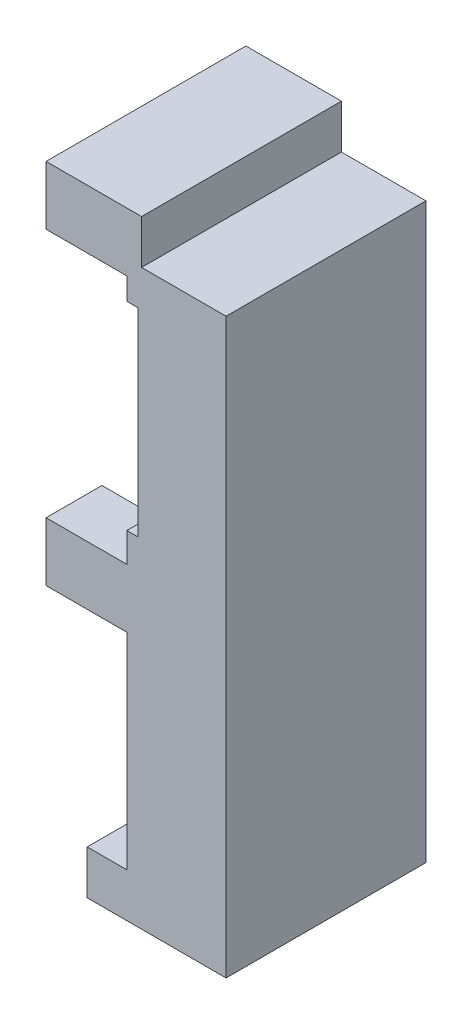
ISO-10303-21;
HEADER;
FILE_DESCRIPTION(('STEP AP214'),'2;1');
FILE_NAME('part.step','',(''),(''),'','','');
FILE_SCHEMA(('AUTOMOTIVE_DESIGN { 1 0 10303 214 1 1 1 1 }'));
ENDSEC;
DATA;
#1=APPLICATION_CONTEXT('core data for automotive mechanical design processes');
#2=APPLICATION_PROTOCOL_DEFINITION('international standard','automotive_design',2000,#1);
#3=PRODUCT_CONTEXT('',#1,'mechanical');
#4=PRODUCT('Part','Part','',(#3));
#5=PRODUCT_RELATED_PRODUCT_CATEGORY('part','',(#4));
#6=PRODUCT_DEFINITION_FORMATION('','',#4);
#7=PRODUCT_DEFINITION_CONTEXT('part definition',#1,'design');
#8=PRODUCT_DEFINITION('design','',#6,#7);
#9=PRODUCT_DEFINITION_SHAPE('','',#8);
#10=(LENGTH_UNIT() NAMED_UNIT(*) SI_UNIT(.MILLI.,.METRE.));
#11=(NAMED_UNIT(*) PLANE_ANGLE_UNIT() SI_UNIT($,.RADIAN.));
#12=(NAMED_UNIT(*) SI_UNIT($,.STERADIAN.) SOLID_ANGLE_UNIT());
#13=UNCERTAINTY_MEASURE_WITH_UNIT(LENGTH_MEASURE(1.E-05),#10,'distance_accuracy_value','');
#14=(GEOMETRIC_REPRESENTATION_CONTEXT(3) GLOBAL_UNCERTAINTY_ASSIGNED_CONTEXT((#13)) GLOBAL_UNIT_ASSIGNED_CONTEXT((#10,
#11,#12)) REPRESENTATION_CONTEXT('',''));
#15=CARTESIAN_POINT('',(0.,0.,0.));
#16=DIRECTION('',(0.,0.,1.));
#17=DIRECTION('',(1.,0.,0.));
#18=AXIS2_PLACEMENT_3D('',#15,#16,#17);
#19=CARTESIAN_POINT('',(10.2,32.,13.6));
#20=DIRECTION('',(1.,0.,0.));
#21=DIRECTION('',(0.,0.,-1.));
#22=AXIS2_PLACEMENT_3D('',#19,#20,#21);
#23=PLANE('',#22);
#24=DIRECTION('',(0.,-1.,0.));
#25=VECTOR('',#24,1.);
#26=CARTESIAN_POINT('',(10.2,32.,3.8));
#27=LINE('',#26,#25);
#28=CARTESIAN_POINT('',(10.2,18.,3.8));
#29=VERTEX_POINT('',#28);
#30=CARTESIAN_POINT('',(10.2,15.,3.8));
#31=VERTEX_POINT('',#30);
#32=EDGE_CURVE('E46',#29,#31,#27,.T.);
#33=ORIENTED_EDGE('',*,*,#32,.T.);
#34=DIRECTION('',(0.,0.,1.));
#35=VECTOR('',#34,1.);
#36=CARTESIAN_POINT('',(10.2,15.,13.6));
#37=LINE('',#36,#35);
#38=CARTESIAN_POINT('',(10.2,15.,9.8));
#39=VERTEX_POINT('',#38);
#40=EDGE_CURVE('E287',#31,#39,#37,.T.);
#41=ORIENTED_EDGE('',*,*,#40,.T.);
#42=DIRECTION('',(0.,-1.,0.));
#43=VECTOR('',#42,1.);
#44=CARTESIAN_POINT('',(10.2,32.,9.8));
#45=LINE('',#44,#43);
#46=CARTESIAN_POINT('',(10.2,18.,9.8));
#47=VERTEX_POINT('',#46);
#48=EDGE_CURVE('E11',#47,#39,#45,.T.);
#49=ORIENTED_EDGE('',*,*,#48,.F.);
#50=DIRECTION('',(0.,0.,-1.));
#51=VECTOR('',#50,1.);
#52=CARTESIAN_POINT('',(10.2,18.,13.6));
#53=LINE('',#52,#51);
#54=CARTESIAN_POINT('',(10.2,18.,13.6));
#55=VERTEX_POINT('',#54);
#56=EDGE_CURVE('E55',#55,#47,#53,.T.);
#57=ORIENTED_EDGE('',*,*,#56,.F.);
#58=DIRECTION('',(0.,-1.,0.));
#59=VECTOR('',#58,1.);
#60=CARTESIAN_POINT('',(10.2,32.,13.6));
#61=LINE('',#60,#59);
#62=CARTESIAN_POINT('',(10.2,32.,13.6));
#63=VERTEX_POINT('',#62);
#64=EDGE_CURVE('E294',#63,#55,#61,.T.);
#65=ORIENTED_EDGE('',*,*,#64,.F.);
#66=DIRECTION('',(0.,0.,-1.));
#67=VECTOR('',#66,1.);
#68=CARTESIAN_POINT('',(10.2,32.,13.6));
#69=LINE('',#68,#67);
#70=CARTESIAN_POINT('',(10.2,32.,9.8));
#71=VERTEX_POINT('',#70);
#72=EDGE_CURVE('E364',#63,#71,#69,.T.);
#73=ORIENTED_EDGE('',*,*,#72,.T.);
#74=DIRECTION('',(0.,-1.,0.));
#75=VECTOR('',#74,1.);
#76=CARTESIAN_POINT('',(10.2,32.,9.8));
#77=LINE('',#76,#75);
#78=CARTESIAN_POINT('',(10.2,31.,9.8));
#79=VERTEX_POINT('',#78);
#80=EDGE_CURVE('E485',#71,#79,#77,.T.);
#81=ORIENTED_EDGE('',*,*,#80,.T.);
#82=DIRECTION('',(0.,0.,-1.));
#83=VECTOR('',#82,1.);
#84=CARTESIAN_POINT('',(10.2,31.,13.6));
#85=LINE('',#84,#83);
#86=CARTESIAN_POINT('',(10.2,31.,3.8));
#87=VERTEX_POINT('',#86);
#88=EDGE_CURVE('E422',#79,#87,#85,.T.);
#89=ORIENTED_EDGE('',*,*,#88,.T.);
#90=DIRECTION('',(0.,-1.,0.));
#91=VECTOR('',#90,1.);
#92=CARTESIAN_POINT('',(10.2,32.,3.8));
#93=LINE('',#92,#91);
#94=CARTESIAN_POINT('',(10.2,32.,3.8));
#95=VERTEX_POINT('',#94);
#96=EDGE_CURVE('E495',#95,#87,#93,.T.);
#97=ORIENTED_EDGE('',*,*,#96,.F.);
#98=CARTESIAN_POINT('',(10.2,32.,0.));
#99=VERTEX_POINT('',#98);
#100=EDGE_CURVE('E325',#95,#99,#69,.T.);
#101=ORIENTED_EDGE('',*,*,#100,.T.);
#102=DIRECTION('',(0.,-1.,0.));
#103=VECTOR('',#102,1.);
#104=CARTESIAN_POINT('',(10.2,32.,0.));
#105=LINE('',#104,#103);
#106=CARTESIAN_POINT('',(10.2,18.,0.));
#107=VERTEX_POINT('',#106);
#108=EDGE_CURVE('E326',#99,#107,#105,.T.);
#109=ORIENTED_EDGE('',*,*,#108,.T.);
#110=DIRECTION('',(0.,0.,-1.));
#111=VECTOR('',#110,1.);
#112=CARTESIAN_POINT('',(10.2,18.,13.6));
#113=LINE('',#112,#111);
#114=EDGE_CURVE('E431',#29,#107,#113,.T.);
#115=ORIENTED_EDGE('',*,*,#114,.F.);
#116=EDGE_LOOP('',(#33,#41,#49,#57,#65,#73,#81,#89,#97,#101,#109,#115));
#117=FACE_BOUND('',#116,.T.);
#118=ADVANCED_FACE('F39',(#117),#23,.F.);
#119=CARTESIAN_POINT('',(10.2,38.,13.6));
#120=DIRECTION('',(1.,0.,0.));
#121=DIRECTION('',(0.,0.,-1.));
#122=AXIS2_PLACEMENT_3D('',#119,#120,#121);
#123=PLANE('',#122);
#124=DIRECTION('',(0.,-1.,0.));
#125=VECTOR('',#124,1.);
#126=CARTESIAN_POINT('',(10.2,38.,3.8));
#127=LINE('',#126,#125);
#128=CARTESIAN_POINT('',(10.2,36.2,3.8));
#129=VERTEX_POINT('',#128);
#130=CARTESIAN_POINT('',(10.2,36.,3.8));
#131=VERTEX_POINT('',#130);
#132=EDGE_CURVE('E497',#129,#131,#127,.T.);
#133=ORIENTED_EDGE('',*,*,#132,.F.);
#134=DIRECTION('',(0.,0.,1.));
#135=VECTOR('',#134,1.);
#136=CARTESIAN_POINT('',(10.2,36.2,13.6));
#137=LINE('',#136,#135);
#138=CARTESIAN_POINT('',(10.2,36.2,9.8));
#139=VERTEX_POINT('',#138);
#140=EDGE_CURVE('E425',#129,#139,#137,.T.);
#141=ORIENTED_EDGE('',*,*,#140,.T.);
#142=DIRECTION('',(0.,-1.,0.));
#143=VECTOR('',#142,1.);
#144=CARTESIAN_POINT('',(10.2,38.,9.8));
#145=LINE('',#144,#143);
#146=CARTESIAN_POINT('',(10.2,36.,9.8));
#147=VERTEX_POINT('',#146);
#148=EDGE_CURVE('E488',#139,#147,#145,.T.);
#149=ORIENTED_EDGE('',*,*,#148,.T.);
#150=DIRECTION('',(0.,0.,-1.));
#151=VECTOR('',#150,1.);
#152=CARTESIAN_POINT('',(10.2,36.,13.6));
#153=LINE('',#152,#151);
#154=CARTESIAN_POINT('',(10.2,36.,13.6));
#155=VERTEX_POINT('',#154);
#156=EDGE_CURVE('E376',#155,#147,#153,.T.);
#157=ORIENTED_EDGE('',*,*,#156,.F.);
#158=DIRECTION('',(0.,-1.,0.));
#159=VECTOR('',#158,1.);
#160=CARTESIAN_POINT('',(10.2,38.,13.6));
#161=LINE('',#160,#159);
#162=CARTESIAN_POINT('',(10.2,38.,13.6));
#163=VERTEX_POINT('',#162);
#164=EDGE_CURVE('E317',#163,#155,#161,.T.);
#165=ORIENTED_EDGE('',*,*,#164,.F.);
#166=DIRECTION('',(0.,0.,-1.));
#167=VECTOR('',#166,1.);
#168=CARTESIAN_POINT('',(10.2,38.,13.6));
#169=LINE('',#168,#167);
#170=CARTESIAN_POINT('',(10.2,38.,9.6));
#171=VERTEX_POINT('',#170);
#172=EDGE_CURVE('E380',#163,#171,#169,.T.);
#173=ORIENTED_EDGE('',*,*,#172,.T.);
#174=DIRECTION('',(0.,-1.,0.));
#175=VECTOR('',#174,1.);
#176=CARTESIAN_POINT('',(10.2,38.,9.6));
#177=LINE('',#176,#175);
#178=CARTESIAN_POINT('',(10.2,37.5,9.6));
#179=VERTEX_POINT('',#178);
#180=EDGE_CURVE('E409',#171,#179,#177,.T.);
#181=ORIENTED_EDGE('',*,*,#180,.T.);
#182=DIRECTION('',(0.,0.,-1.));
#183=VECTOR('',#182,1.);
#184=CARTESIAN_POINT('',(10.2,37.5,13.6));
#185=LINE('',#184,#183);
#186=CARTESIAN_POINT('',(10.2,37.5,4.));
#187=VERTEX_POINT('',#186);
#188=EDGE_CURVE('E412',#179,#187,#185,.T.);
#189=ORIENTED_EDGE('',*,*,#188,.T.);
#190=DIRECTION('',(0.,-1.,0.));
#191=VECTOR('',#190,1.);
#192=CARTESIAN_POINT('',(10.2,38.,4.));
#193=LINE('',#192,#191);
#194=CARTESIAN_POINT('',(10.2,38.,4.));
#195=VERTEX_POINT('',#194);
#196=EDGE_CURVE('E415',#195,#187,#193,.T.);
#197=ORIENTED_EDGE('',*,*,#196,.F.);
#198=CARTESIAN_POINT('',(10.2,38.,0.));
#199=VERTEX_POINT('',#198);
#200=EDGE_CURVE('E379',#195,#199,#169,.T.);
#201=ORIENTED_EDGE('',*,*,#200,.T.);
#202=DIRECTION('',(0.,-1.,0.));
#203=VECTOR('',#202,1.);
#204=CARTESIAN_POINT('',(10.2,38.,0.));
#205=LINE('',#204,#203);
#206=CARTESIAN_POINT('',(10.2,36.,0.));
#207=VERTEX_POINT('',#206);
#208=EDGE_CURVE('E353',#199,#207,#205,.T.);
#209=ORIENTED_EDGE('',*,*,#208,.T.);
#210=EDGE_CURVE('E375',#131,#207,#153,.T.);
#211=ORIENTED_EDGE('',*,*,#210,.F.);
#212=EDGE_LOOP('',(#133,#141,#149,#157,#165,#173,#181,#189,#197,#201,#209,#211));
#213=FACE_BOUND('',#212,.T.);
#214=ADVANCED_FACE('F550',(#213),#123,.F.);
#215=CARTESIAN_POINT('',(10.2,36.,13.6));
#216=DIRECTION('',(0.,-1.,0.));
#217=DIRECTION('',(0.,0.,-1.));
#218=AXIS2_PLACEMENT_3D('',#215,#216,#217);
#219=PLANE('',#218);
#220=DIRECTION('',(-1.,0.,0.));
#221=VECTOR('',#220,1.);
#222=CARTESIAN_POINT('',(10.2,36.,3.8));
#223=LINE('',#222,#221);
#224=CARTESIAN_POINT('',(4.7,36.,3.8));
#225=VERTEX_POINT('',#224);
#226=EDGE_CURVE('E493',#131,#225,#223,.T.);
#227=ORIENTED_EDGE('',*,*,#226,.F.);
#228=ORIENTED_EDGE('',*,*,#210,.T.);
#229=DIRECTION('',(-1.,0.,0.));
#230=VECTOR('',#229,1.);
#231=CARTESIAN_POINT('',(10.2,36.,0.));
#232=LINE('',#231,#230);
#233=CARTESIAN_POINT('',(4.7,36.,0.));
#234=VERTEX_POINT('',#233);
#235=EDGE_CURVE('E356',#207,#234,#232,.T.);
#236=ORIENTED_EDGE('',*,*,#235,.T.);
#237=DIRECTION('',(0.,0.,-1.));
#238=VECTOR('',#237,1.);
#239=CARTESIAN_POINT('',(4.7,36.,13.6));
#240=LINE('',#239,#238);
#241=EDGE_CURVE('E371',#225,#234,#240,.T.);
#242=ORIENTED_EDGE('',*,*,#241,.F.);
#243=EDGE_LOOP('',(#227,#228,#236,#242));
#244=FACE_BOUND('',#243,.T.);
#245=ADVANCED_FACE('F613',(#244),#219,.F.);
#246=CARTESIAN_POINT('',(4.7,36.,13.6));
#247=DIRECTION('',(1.,0.,0.));
#248=DIRECTION('',(0.,0.,-1.));
#249=AXIS2_PLACEMENT_3D('',#246,#247,#248);
#250=PLANE('',#249);
#251=DIRECTION('',(0.,-1.,0.));
#252=VECTOR('',#251,1.);
#253=CARTESIAN_POINT('',(4.7,36.,3.8));
#254=LINE('',#253,#252);
#255=CARTESIAN_POINT('',(4.7,32.,3.8));
#256=VERTEX_POINT('',#255);
#257=EDGE_CURVE('E491',#225,#256,#254,.T.);
#258=ORIENTED_EDGE('',*,*,#257,.F.);
#259=ORIENTED_EDGE('',*,*,#241,.T.);
#260=DIRECTION('',(0.,-1.,0.));
#261=VECTOR('',#260,1.);
#262=CARTESIAN_POINT('',(4.7,36.,0.));
#263=LINE('',#262,#261);
#264=CARTESIAN_POINT('',(4.7,32.,0.));
#265=VERTEX_POINT('',#264);
#266=EDGE_CURVE('E359',#234,#265,#263,.T.);
#267=ORIENTED_EDGE('',*,*,#266,.T.);
#268=DIRECTION('',(0.,0.,-1.));
#269=VECTOR('',#268,1.);
#270=CARTESIAN_POINT('',(4.7,32.,13.6));
#271=LINE('',#270,#269);
#272=EDGE_CURVE('E367',#256,#265,#271,.T.);
#273=ORIENTED_EDGE('',*,*,#272,.F.);
#274=EDGE_LOOP('',(#258,#259,#267,#273));
#275=FACE_BOUND('',#274,.T.);
#276=ADVANCED_FACE('F609',(#275),#250,.F.);
#277=CARTESIAN_POINT('',(4.7,32.,13.6));
#278=DIRECTION('',(0.,1.,0.));
#279=DIRECTION('',(0.,0.,1.));
#280=AXIS2_PLACEMENT_3D('',#277,#278,#279);
#281=PLANE('',#280);
#282=DIRECTION('',(1.,0.,0.));
#283=VECTOR('',#282,1.);
#284=CARTESIAN_POINT('',(4.7,32.,3.8));
#285=LINE('',#284,#283);
#286=EDGE_CURVE('E420',#256,#95,#285,.T.);
#287=ORIENTED_EDGE('',*,*,#286,.F.);
#288=ORIENTED_EDGE('',*,*,#272,.T.);
#289=DIRECTION('',(1.,0.,0.));
#290=VECTOR('',#289,1.);
#291=CARTESIAN_POINT('',(4.7,32.,0.));
#292=LINE('',#291,#290);
#293=EDGE_CURVE('E298',#265,#99,#292,.T.);
#294=ORIENTED_EDGE('',*,*,#293,.T.);
#295=ORIENTED_EDGE('',*,*,#100,.F.);
#296=EDGE_LOOP('',(#287,#288,#294,#295));
#297=FACE_BOUND('',#296,.T.);
#298=ADVANCED_FACE('F605',(#297),#281,.F.);
#299=CARTESIAN_POINT('',(10.95,51.5,13.6));
#300=DIRECTION('',(1.,0.,0.));
#301=DIRECTION('',(0.,0.,-1.));
#302=AXIS2_PLACEMENT_3D('',#299,#300,#301);
#303=PLANE('',#302);
#304=DIRECTION('',(0.,-1.,0.));
#305=VECTOR('',#304,1.);
#306=CARTESIAN_POINT('',(10.95,51.5,4.));
#307=LINE('',#306,#305);
#308=CARTESIAN_POINT('',(10.95,51.5,4.));
#309=VERTEX_POINT('',#308);
#310=CARTESIAN_POINT('',(10.95,38.,4.));
#311=VERTEX_POINT('',#310);
#312=EDGE_CURVE('E329',#309,#311,#307,.T.);
#313=ORIENTED_EDGE('',*,*,#312,.F.);
#314=DIRECTION('',(0.,0.,-1.));
#315=VECTOR('',#314,1.);
#316=CARTESIAN_POINT('',(10.95,51.5,13.6));
#317=LINE('',#316,#315);
#318=CARTESIAN_POINT('',(10.95,51.5,0.));
#319=VERTEX_POINT('',#318);
#320=EDGE_CURVE('E387',#309,#319,#317,.T.);
#321=ORIENTED_EDGE('',*,*,#320,.T.);
#322=DIRECTION('',(0.,-1.,0.));
#323=VECTOR('',#322,1.);
#324=CARTESIAN_POINT('',(10.95,51.5,0.));
#325=LINE('',#324,#323);
#326=CARTESIAN_POINT('',(10.95,38.,0.));
#327=VERTEX_POINT('',#326);
#328=EDGE_CURVE('E347',#319,#327,#325,.T.);
#329=ORIENTED_EDGE('',*,*,#328,.T.);
#330=DIRECTION('',(0.,0.,-1.));
#331=VECTOR('',#330,1.);
#332=CARTESIAN_POINT('',(10.95,38.,13.6));
#333=LINE('',#332,#331);
#334=EDGE_CURVE('E383',#311,#327,#333,.T.);
#335=ORIENTED_EDGE('',*,*,#334,.F.);
#336=EDGE_LOOP('',(#313,#321,#329,#335));
#337=FACE_BOUND('',#336,.T.);
#338=ADVANCED_FACE('F538',(#337),#303,.F.);
#339=CARTESIAN_POINT('',(10.95,38.,13.6));
#340=DIRECTION('',(0.,-1.,0.));
#341=DIRECTION('',(0.,0.,-1.));
#342=AXIS2_PLACEMENT_3D('',#339,#340,#341);
#343=PLANE('',#342);
#344=DIRECTION('',(-1.,0.,0.));
#345=VECTOR('',#344,1.);
#346=CARTESIAN_POINT('',(10.95,38.,4.));
#347=LINE('',#346,#345);
#348=EDGE_CURVE('E525',#311,#195,#347,.T.);
#349=ORIENTED_EDGE('',*,*,#348,.F.);
#350=ORIENTED_EDGE('',*,*,#334,.T.);
#351=DIRECTION('',(-1.,0.,0.));
#352=VECTOR('',#351,1.);
#353=CARTESIAN_POINT('',(10.95,38.,0.));
#354=LINE('',#353,#352);
#355=EDGE_CURVE('E350',#327,#199,#354,.T.);
#356=ORIENTED_EDGE('',*,*,#355,.T.);
#357=ORIENTED_EDGE('',*,*,#200,.F.);
#358=EDGE_LOOP('',(#349,#350,#356,#357));
#359=FACE_BOUND('',#358,.T.);
#360=ADVANCED_FACE('F537',(#359),#343,.F.);
#361=CARTESIAN_POINT('',(16.95,0.,13.6));
#362=DIRECTION('',(-1.,0.,0.));
#363=DIRECTION('',(0.,0.,1.));
#364=AXIS2_PLACEMENT_3D('',#361,#362,#363);
#365=PLANE('',#364);
#366=DIRECTION('',(0.,1.,0.));
#367=VECTOR('',#366,1.);
#368=CARTESIAN_POINT('',(16.95,0.,13.6));
#369=LINE('',#368,#367);
#370=CARTESIAN_POINT('',(16.95,15.,13.6));
#371=VERTEX_POINT('',#370);
#372=CARTESIAN_POINT('',(16.95,54.,13.6));
#373=VERTEX_POINT('',#372);
#374=EDGE_CURVE('E271',#371,#373,#369,.T.);
#375=ORIENTED_EDGE('',*,*,#374,.F.);
#376=DIRECTION('',(0.,0.,-1.));
#377=VECTOR('',#376,1.);
#378=CARTESIAN_POINT('',(16.95,15.,13.6));
#379=LINE('',#378,#377);
#380=CARTESIAN_POINT('',(16.95,15.,0.));
#381=VERTEX_POINT('',#380);
#382=EDGE_CURVE('E281',#371,#381,#379,.T.);
#383=ORIENTED_EDGE('',*,*,#382,.T.);
#384=DIRECTION('',(0.,1.,0.));
#385=VECTOR('',#384,1.);
#386=CARTESIAN_POINT('',(16.95,0.,0.));
#387=LINE('',#386,#385);
#388=CARTESIAN_POINT('',(16.95,54.,0.));
#389=VERTEX_POINT('',#388);
#390=EDGE_CURVE('E328',#381,#389,#387,.T.);
#391=ORIENTED_EDGE('',*,*,#390,.T.);
#392=DIRECTION('',(0.,0.,-1.));
#393=VECTOR('',#392,1.);
#394=CARTESIAN_POINT('',(16.95,54.,13.6));
#395=LINE('',#394,#393);
#396=EDGE_CURVE('E291',#373,#389,#395,.T.);
#397=ORIENTED_EDGE('',*,*,#396,.F.);
#398=EDGE_LOOP('',(#375,#383,#391,#397));
#399=FACE_BOUND('',#398,.T.);
#400=ADVANCED_FACE('F289',(#399),#365,.F.);
#401=CARTESIAN_POINT('',(16.95,54.,13.6));
#402=DIRECTION('',(0.,-1.,0.));
#403=DIRECTION('',(0.,0.,-1.));
#404=AXIS2_PLACEMENT_3D('',#401,#402,#403);
#405=PLANE('',#404);
#406=DIRECTION('',(-1.,0.,0.));
#407=VECTOR('',#406,1.);
#408=CARTESIAN_POINT('',(16.95,54.,0.));
#409=LINE('',#408,#407);
#410=CARTESIAN_POINT('',(11.2,54.,0.));
#411=VERTEX_POINT('',#410);
#412=EDGE_CURVE('E331',#389,#411,#409,.T.);
#413=ORIENTED_EDGE('',*,*,#412,.T.);
#414=DIRECTION('',(0.,0.,-1.));
#415=VECTOR('',#414,1.);
#416=CARTESIAN_POINT('',(11.2,54.,13.6));
#417=LINE('',#416,#415);
#418=CARTESIAN_POINT('',(11.2,54.,13.6));
#419=VERTEX_POINT('',#418);
#420=EDGE_CURVE('E405',#419,#411,#417,.T.);
#421=ORIENTED_EDGE('',*,*,#420,.F.);
#422=DIRECTION('',(-1.,0.,0.));
#423=VECTOR('',#422,1.);
#424=CARTESIAN_POINT('',(16.95,54.,13.6));
#425=LINE('',#424,#423);
#426=EDGE_CURVE('E293',#373,#419,#425,.T.);
#427=ORIENTED_EDGE('',*,*,#426,.F.);
#428=ORIENTED_EDGE('',*,*,#396,.T.);
#429=EDGE_LOOP('',(#413,#421,#427,#428));
#430=FACE_BOUND('',#429,.T.);
#431=ADVANCED_FACE('F591',(#430),#405,.F.);
#432=CARTESIAN_POINT('',(11.2,54.,13.6));
#433=DIRECTION('',(-1.,0.,0.));
#434=DIRECTION('',(0.,0.,1.));
#435=AXIS2_PLACEMENT_3D('',#432,#433,#434);
#436=PLANE('',#435);
#437=DIRECTION('',(0.,1.,0.));
#438=VECTOR('',#437,1.);
#439=CARTESIAN_POINT('',(11.2,54.,0.));
#440=LINE('',#439,#438);
#441=CARTESIAN_POINT('',(11.2,57.,0.));
#442=VERTEX_POINT('',#441);
#443=EDGE_CURVE('E333',#411,#442,#440,.T.);
#444=ORIENTED_EDGE('',*,*,#443,.T.);
#445=DIRECTION('',(0.,0.,-1.));
#446=VECTOR('',#445,1.);
#447=CARTESIAN_POINT('',(11.2,57.,13.6));
#448=LINE('',#447,#446);
#449=CARTESIAN_POINT('',(11.2,57.,13.6));
#450=VERTEX_POINT('',#449);
#451=EDGE_CURVE('E402',#450,#442,#448,.T.);
#452=ORIENTED_EDGE('',*,*,#451,.F.);
#453=DIRECTION('',(0.,1.,0.));
#454=VECTOR('',#453,1.);
#455=CARTESIAN_POINT('',(11.2,54.,13.6));
#456=LINE('',#455,#454);
#457=EDGE_CURVE('E296',#419,#450,#456,.T.);
#458=ORIENTED_EDGE('',*,*,#457,.F.);
#459=ORIENTED_EDGE('',*,*,#420,.T.);
#460=EDGE_LOOP('',(#444,#452,#458,#459));
#461=FACE_BOUND('',#460,.T.);
#462=ADVANCED_FACE('F588',(#461),#436,.F.);
#463=CARTESIAN_POINT('',(11.2,57.,13.6));
#464=DIRECTION('',(0.,-1.,0.));
#465=DIRECTION('',(0.,0.,-1.));
#466=AXIS2_PLACEMENT_3D('',#463,#464,#465);
#467=PLANE('',#466);
#468=DIRECTION('',(-1.,0.,0.));
#469=VECTOR('',#468,1.);
#470=CARTESIAN_POINT('',(11.2,57.,0.));
#471=LINE('',#470,#469);
#472=CARTESIAN_POINT('',(4.7,57.,0.));
#473=VERTEX_POINT('',#472);
#474=EDGE_CURVE('E335',#442,#473,#471,.T.);
#475=ORIENTED_EDGE('',*,*,#474,.T.);
#476=DIRECTION('',(0.,0.,-1.));
#477=VECTOR('',#476,1.);
#478=CARTESIAN_POINT('',(4.7,57.,13.6));
#479=LINE('',#478,#477);
#480=CARTESIAN_POINT('',(4.7,57.,13.6));
#481=VERTEX_POINT('',#480);
#482=EDGE_CURVE('E399',#481,#473,#479,.T.);
#483=ORIENTED_EDGE('',*,*,#482,.F.);
#484=DIRECTION('',(-1.,0.,0.));
#485=VECTOR('',#484,1.);
#486=CARTESIAN_POINT('',(11.2,57.,13.6));
#487=LINE('',#486,#485);
#488=EDGE_CURVE('E303',#450,#481,#487,.T.);
#489=ORIENTED_EDGE('',*,*,#488,.F.);
#490=ORIENTED_EDGE('',*,*,#451,.T.);
#491=EDGE_LOOP('',(#475,#483,#489,#490));
#492=FACE_BOUND('',#491,.T.);
#493=ADVANCED_FACE('F583',(#492),#467,.F.);
#494=CARTESIAN_POINT('',(4.7,57.,13.6));
#495=DIRECTION('',(1.,0.,0.));
#496=DIRECTION('',(0.,0.,-1.));
#497=AXIS2_PLACEMENT_3D('',#494,#495,#496);
#498=PLANE('',#497);
#499=DIRECTION('',(0.,-1.,0.));
#500=VECTOR('',#499,1.);
#501=CARTESIAN_POINT('',(4.7,57.,0.));
#502=LINE('',#501,#500);
#503=CARTESIAN_POINT('',(4.7,53.,0.));
#504=VERTEX_POINT('',#503);
#505=EDGE_CURVE('E337',#473,#504,#502,.T.);
#506=ORIENTED_EDGE('',*,*,#505,.T.);
#507=DIRECTION('',(0.,0.,-1.));
#508=VECTOR('',#507,1.);
#509=CARTESIAN_POINT('',(4.7,53.,13.6));
#510=LINE('',#509,#508);
#511=CARTESIAN_POINT('',(4.7,53.,13.6));
#512=VERTEX_POINT('',#511);
#513=EDGE_CURVE('E396',#512,#504,#510,.T.);
#514=ORIENTED_EDGE('',*,*,#513,.F.);
#515=DIRECTION('',(0.,-1.,0.));
#516=VECTOR('',#515,1.);
#517=CARTESIAN_POINT('',(4.7,57.,13.6));
#518=LINE('',#517,#516);
#519=EDGE_CURVE('E305',#481,#512,#518,.T.);
#520=ORIENTED_EDGE('',*,*,#519,.F.);
#521=ORIENTED_EDGE('',*,*,#482,.T.);
#522=EDGE_LOOP('',(#506,#514,#520,#521));
#523=FACE_BOUND('',#522,.T.);
#524=ADVANCED_FACE('F577',(#523),#498,.F.);
#525=CARTESIAN_POINT('',(4.7,53.,13.6));
#526=DIRECTION('',(0.,1.,0.));
#527=DIRECTION('',(0.,0.,1.));
#528=AXIS2_PLACEMENT_3D('',#525,#526,#527);
#529=PLANE('',#528);
#530=DIRECTION('',(1.,0.,0.));
#531=VECTOR('',#530,1.);
#532=CARTESIAN_POINT('',(4.7,53.,0.));
#533=LINE('',#532,#531);
#534=CARTESIAN_POINT('',(10.2,53.,0.));
#535=VERTEX_POINT('',#534);
#536=EDGE_CURVE('E339',#504,#535,#533,.T.);
#537=ORIENTED_EDGE('',*,*,#536,.T.);
#538=DIRECTION('',(0.,0.,-1.));
#539=VECTOR('',#538,1.);
#540=CARTESIAN_POINT('',(10.2,53.,13.6));
#541=LINE('',#540,#539);
#542=CARTESIAN_POINT('',(10.2,53.,13.6));
#543=VERTEX_POINT('',#542);
#544=EDGE_CURVE('E393',#543,#535,#541,.T.);
#545=ORIENTED_EDGE('',*,*,#544,.F.);
#546=DIRECTION('',(1.,0.,0.));
#547=VECTOR('',#546,1.);
#548=CARTESIAN_POINT('',(4.7,53.,13.6));
#549=LINE('',#548,#547);
#550=EDGE_CURVE('E307',#512,#543,#549,.T.);
#551=ORIENTED_EDGE('',*,*,#550,.F.);
#552=ORIENTED_EDGE('',*,*,#513,.T.);
#553=EDGE_LOOP('',(#537,#545,#551,#552));
#554=FACE_BOUND('',#553,.T.);
#555=ADVANCED_FACE('F573',(#554),#529,.F.);
#556=CARTESIAN_POINT('',(10.2,53.,13.6));
#557=DIRECTION('',(1.,0.,0.));
#558=DIRECTION('',(0.,0.,-1.));
#559=AXIS2_PLACEMENT_3D('',#556,#557,#558);
#560=PLANE('',#559);
#561=DIRECTION('',(0.,-1.,0.));
#562=VECTOR('',#561,1.);
#563=CARTESIAN_POINT('',(10.2,53.,0.));
#564=LINE('',#563,#562);
#565=CARTESIAN_POINT('',(10.2,51.5,0.));
#566=VERTEX_POINT('',#565);
#567=EDGE_CURVE('E341',#535,#566,#564,.T.);
#568=ORIENTED_EDGE('',*,*,#567,.T.);
#569=DIRECTION('',(0.,0.,-1.));
#570=VECTOR('',#569,1.);
#571=CARTESIAN_POINT('',(10.2,51.5,13.6));
#572=LINE('',#571,#570);
#573=CARTESIAN_POINT('',(10.2,51.5,13.6));
#574=VERTEX_POINT('',#573);
#575=EDGE_CURVE('E391',#574,#566,#572,.T.);
#576=ORIENTED_EDGE('',*,*,#575,.F.);
#577=DIRECTION('',(0.,-1.,0.));
#578=VECTOR('',#577,1.);
#579=CARTESIAN_POINT('',(10.2,53.,13.6));
#580=LINE('',#579,#578);
#581=EDGE_CURVE('E309',#543,#574,#580,.T.);
#582=ORIENTED_EDGE('',*,*,#581,.F.);
#583=ORIENTED_EDGE('',*,*,#544,.T.);
#584=EDGE_LOOP('',(#568,#576,#582,#583));
#585=FACE_BOUND('',#584,.T.);
#586=ADVANCED_FACE('F568',(#585),#560,.F.);
#587=CARTESIAN_POINT('',(10.2,51.5,13.6));
#588=DIRECTION('',(0.,1.,0.));
#589=DIRECTION('',(0.,0.,1.));
#590=AXIS2_PLACEMENT_3D('',#587,#588,#589);
#591=PLANE('',#590);
#592=ORIENTED_EDGE('',*,*,#575,.T.);
#593=DIRECTION('',(1.,0.,0.));
#594=VECTOR('',#593,1.);
#595=CARTESIAN_POINT('',(10.2,51.5,0.));
#596=LINE('',#595,#594);
#597=EDGE_CURVE('E344',#566,#319,#596,.T.);
#598=ORIENTED_EDGE('',*,*,#597,.T.);
#599=ORIENTED_EDGE('',*,*,#320,.F.);
#600=DIRECTION('',(-1.,0.,0.));
#601=VECTOR('',#600,1.);
#602=CARTESIAN_POINT('',(15.4,51.5,4.));
#603=LINE('',#602,#601);
#604=CARTESIAN_POINT('',(15.4,51.5,4.));
#605=VERTEX_POINT('',#604);
#606=EDGE_CURVE('E506',#605,#309,#603,.T.);
#607=ORIENTED_EDGE('',*,*,#606,.F.);
#608=DIRECTION('',(0.,0.,1.));
#609=VECTOR('',#608,1.);
#610=CARTESIAN_POINT('',(15.4,51.5,4.));
#611=LINE('',#610,#609);
#612=CARTESIAN_POINT('',(15.4,51.5,9.6));
#613=VERTEX_POINT('',#612);
#614=EDGE_CURVE('E515',#605,#613,#611,.T.);
#615=ORIENTED_EDGE('',*,*,#614,.T.);
#616=DIRECTION('',(-1.,0.,0.));
#617=VECTOR('',#616,1.);
#618=CARTESIAN_POINT('',(15.4,51.5,9.6));
#619=LINE('',#618,#617);
#620=CARTESIAN_POINT('',(10.95,51.5,9.6));
#621=VERTEX_POINT('',#620);
#622=EDGE_CURVE('E503',#613,#621,#619,.T.);
#623=ORIENTED_EDGE('',*,*,#622,.T.);
#624=CARTESIAN_POINT('',(10.95,51.5,13.6));
#625=VERTEX_POINT('',#624);
#626=EDGE_CURVE('E388',#625,#621,#317,.T.);
#627=ORIENTED_EDGE('',*,*,#626,.F.);
#628=DIRECTION('',(1.,0.,0.));
#629=VECTOR('',#628,1.);
#630=CARTESIAN_POINT('',(10.2,51.5,13.6));
#631=LINE('',#630,#629);
#632=EDGE_CURVE('E311',#574,#625,#631,.T.);
#633=ORIENTED_EDGE('',*,*,#632,.F.);
#634=EDGE_LOOP('',(#592,#598,#599,#607,#615,#623,#627,#633));
#635=FACE_BOUND('',#634,.T.);
#636=ADVANCED_FACE('F561',(#635),#591,.F.);
#637=ORIENTED_EDGE('',*,*,#626,.T.);
#638=DIRECTION('',(0.,-1.,0.));
#639=VECTOR('',#638,1.);
#640=CARTESIAN_POINT('',(10.95,51.5,9.6));
#641=LINE('',#640,#639);
#642=CARTESIAN_POINT('',(10.95,38.,9.6));
#643=VERTEX_POINT('',#642);
#644=EDGE_CURVE('E522',#621,#643,#641,.T.);
#645=ORIENTED_EDGE('',*,*,#644,.T.);
#646=CARTESIAN_POINT('',(10.95,38.,13.6));
#647=VERTEX_POINT('',#646);
#648=EDGE_CURVE('E384',#647,#643,#333,.T.);
#649=ORIENTED_EDGE('',*,*,#648,.F.);
#650=DIRECTION('',(0.,-1.,0.));
#651=VECTOR('',#650,1.);
#652=CARTESIAN_POINT('',(10.95,51.5,13.6));
#653=LINE('',#652,#651);
#654=EDGE_CURVE('E313',#625,#647,#653,.T.);
#655=ORIENTED_EDGE('',*,*,#654,.F.);
#656=EDGE_LOOP('',(#637,#645,#649,#655));
#657=FACE_BOUND('',#656,.T.);
#658=ADVANCED_FACE('F645',(#657),#303,.F.);
#659=ORIENTED_EDGE('',*,*,#648,.T.);
#660=DIRECTION('',(-1.,0.,0.));
#661=VECTOR('',#660,1.);
#662=CARTESIAN_POINT('',(10.95,38.,9.6));
#663=LINE('',#662,#661);
#664=EDGE_CURVE('E517',#643,#171,#663,.T.);
#665=ORIENTED_EDGE('',*,*,#664,.T.);
#666=ORIENTED_EDGE('',*,*,#172,.F.);
#667=DIRECTION('',(-1.,0.,0.));
#668=VECTOR('',#667,1.);
#669=CARTESIAN_POINT('',(10.95,38.,13.6));
#670=LINE('',#669,#668);
#671=EDGE_CURVE('E315',#647,#163,#670,.T.);
#672=ORIENTED_EDGE('',*,*,#671,.F.);
#673=EDGE_LOOP('',(#659,#665,#666,#672));
#674=FACE_BOUND('',#673,.T.);
#675=ADVANCED_FACE('F639',(#674),#343,.F.);
#676=ORIENTED_EDGE('',*,*,#156,.T.);
#677=DIRECTION('',(-1.,0.,0.));
#678=VECTOR('',#677,1.);
#679=CARTESIAN_POINT('',(10.2,36.,9.8));
#680=LINE('',#679,#678);
#681=CARTESIAN_POINT('',(4.7,36.,9.8));
#682=VERTEX_POINT('',#681);
#683=EDGE_CURVE('E482',#147,#682,#680,.T.);
#684=ORIENTED_EDGE('',*,*,#683,.T.);
#685=CARTESIAN_POINT('',(4.7,36.,13.6));
#686=VERTEX_POINT('',#685);
#687=EDGE_CURVE('E372',#686,#682,#240,.T.);
#688=ORIENTED_EDGE('',*,*,#687,.F.);
#689=DIRECTION('',(-1.,0.,0.));
#690=VECTOR('',#689,1.);
#691=CARTESIAN_POINT('',(10.2,36.,13.6));
#692=LINE('',#691,#690);
#693=EDGE_CURVE('E319',#155,#686,#692,.T.);
#694=ORIENTED_EDGE('',*,*,#693,.F.);
#695=EDGE_LOOP('',(#676,#684,#688,#694));
#696=FACE_BOUND('',#695,.T.);
#697=ADVANCED_FACE('F627',(#696),#219,.F.);
#698=ORIENTED_EDGE('',*,*,#687,.T.);
#699=DIRECTION('',(0.,-1.,0.));
#700=VECTOR('',#699,1.);
#701=CARTESIAN_POINT('',(4.7,36.,9.8));
#702=LINE('',#701,#700);
#703=CARTESIAN_POINT('',(4.7,32.,9.8));
#704=VERTEX_POINT('',#703);
#705=EDGE_CURVE('E477',#682,#704,#702,.T.);
#706=ORIENTED_EDGE('',*,*,#705,.T.);
#707=CARTESIAN_POINT('',(4.7,32.,13.6));
#708=VERTEX_POINT('',#707);
#709=EDGE_CURVE('E368',#708,#704,#271,.T.);
#710=ORIENTED_EDGE('',*,*,#709,.F.);
#711=DIRECTION('',(0.,-1.,0.));
#712=VECTOR('',#711,1.);
#713=CARTESIAN_POINT('',(4.7,36.,13.6));
#714=LINE('',#713,#712);
#715=EDGE_CURVE('E321',#686,#708,#714,.T.);
#716=ORIENTED_EDGE('',*,*,#715,.F.);
#717=EDGE_LOOP('',(#698,#706,#710,#716));
#718=FACE_BOUND('',#717,.T.);
#719=ADVANCED_FACE('F631',(#718),#250,.F.);
#720=ORIENTED_EDGE('',*,*,#709,.T.);
#721=DIRECTION('',(1.,0.,0.));
#722=VECTOR('',#721,1.);
#723=CARTESIAN_POINT('',(4.7,32.,9.8));
#724=LINE('',#723,#722);
#725=EDGE_CURVE('E417',#704,#71,#724,.T.);
#726=ORIENTED_EDGE('',*,*,#725,.T.);
#727=ORIENTED_EDGE('',*,*,#72,.F.);
#728=DIRECTION('',(1.,0.,0.));
#729=VECTOR('',#728,1.);
#730=CARTESIAN_POINT('',(4.7,32.,13.6));
#731=LINE('',#730,#729);
#732=EDGE_CURVE('E323',#708,#63,#731,.T.);
#733=ORIENTED_EDGE('',*,*,#732,.F.);
#734=EDGE_LOOP('',(#720,#726,#727,#733));
#735=FACE_BOUND('',#734,.T.);
#736=ADVANCED_FACE('F670',(#735),#281,.F.);
#737=CARTESIAN_POINT('',(0.,0.,13.6));
#738=DIRECTION('',(0.,0.,1.));
#739=DIRECTION('',(1.,0.,0.));
#740=AXIS2_PLACEMENT_3D('',#737,#738,#739);
#741=PLANE('',#740);
#742=DIRECTION('',(1.,0.,0.));
#743=VECTOR('',#742,1.);
#744=CARTESIAN_POINT('',(7.5,15.,13.6));
#745=LINE('',#744,#743);
#746=CARTESIAN_POINT('',(7.5,15.,13.6));
#747=VERTEX_POINT('',#746);
#748=EDGE_CURVE('E267',#747,#371,#745,.T.);
#749=ORIENTED_EDGE('',*,*,#748,.T.);
#750=ORIENTED_EDGE('',*,*,#374,.T.);
#751=ORIENTED_EDGE('',*,*,#426,.T.);
#752=ORIENTED_EDGE('',*,*,#457,.T.);
#753=ORIENTED_EDGE('',*,*,#488,.T.);
#754=ORIENTED_EDGE('',*,*,#519,.T.);
#755=ORIENTED_EDGE('',*,*,#550,.T.);
#756=ORIENTED_EDGE('',*,*,#581,.T.);
#757=ORIENTED_EDGE('',*,*,#632,.T.);
#758=ORIENTED_EDGE('',*,*,#654,.T.);
#759=ORIENTED_EDGE('',*,*,#671,.T.);
#760=ORIENTED_EDGE('',*,*,#164,.T.);
#761=ORIENTED_EDGE('',*,*,#693,.T.);
#762=ORIENTED_EDGE('',*,*,#715,.T.);
#763=ORIENTED_EDGE('',*,*,#732,.T.);
#764=ORIENTED_EDGE('',*,*,#64,.T.);
#765=DIRECTION('',(-1.,0.,0.));
#766=VECTOR('',#765,1.);
#767=CARTESIAN_POINT('',(11.2,18.,13.6));
#768=LINE('',#767,#766);
#769=CARTESIAN_POINT('',(7.5,18.,13.6));
#770=VERTEX_POINT('',#769);
#771=EDGE_CURVE('E278',#55,#770,#768,.T.);
#772=ORIENTED_EDGE('',*,*,#771,.T.);
#773=DIRECTION('',(0.,-1.,0.));
#774=VECTOR('',#773,1.);
#775=CARTESIAN_POINT('',(7.5,18.,13.6));
#776=LINE('',#775,#774);
#777=EDGE_CURVE('E274',#770,#747,#776,.T.);
#778=ORIENTED_EDGE('',*,*,#777,.T.);
#779=EDGE_LOOP('',(#749,#750,#751,#752,#753,#754,#755,#756,#757,#758,#759,#760,#761,#762,#763,
#764,#772,#778));
#780=FACE_BOUND('',#779,.T.);
#781=ADVANCED_FACE('F269',(#780),#741,.T.);
#782=CARTESIAN_POINT('',(0.,0.,0.));
#783=DIRECTION('',(0.,0.,1.));
#784=DIRECTION('',(1.,0.,0.));
#785=AXIS2_PLACEMENT_3D('',#782,#783,#784);
#786=PLANE('',#785);
#787=ORIENTED_EDGE('',*,*,#390,.F.);
#788=DIRECTION('',(1.,0.,0.));
#789=VECTOR('',#788,1.);
#790=CARTESIAN_POINT('',(7.5,15.,0.));
#791=LINE('',#790,#789);
#792=CARTESIAN_POINT('',(7.5,15.,0.));
#793=VERTEX_POINT('',#792);
#794=EDGE_CURVE('E284',#793,#381,#791,.T.);
#795=ORIENTED_EDGE('',*,*,#794,.F.);
#796=DIRECTION('',(0.,-1.,0.));
#797=VECTOR('',#796,1.);
#798=CARTESIAN_POINT('',(7.5,18.,0.));
#799=LINE('',#798,#797);
#800=CARTESIAN_POINT('',(7.5,18.,0.));
#801=VERTEX_POINT('',#800);
#802=EDGE_CURVE('E448',#801,#793,#799,.T.);
#803=ORIENTED_EDGE('',*,*,#802,.F.);
#804=DIRECTION('',(-1.,0.,0.));
#805=VECTOR('',#804,1.);
#806=CARTESIAN_POINT('',(11.2,18.,0.));
#807=LINE('',#806,#805);
#808=EDGE_CURVE('E444',#107,#801,#807,.T.);
#809=ORIENTED_EDGE('',*,*,#808,.F.);
#810=ORIENTED_EDGE('',*,*,#108,.F.);
#811=ORIENTED_EDGE('',*,*,#293,.F.);
#812=ORIENTED_EDGE('',*,*,#266,.F.);
#813=ORIENTED_EDGE('',*,*,#235,.F.);
#814=ORIENTED_EDGE('',*,*,#208,.F.);
#815=ORIENTED_EDGE('',*,*,#355,.F.);
#816=ORIENTED_EDGE('',*,*,#328,.F.);
#817=ORIENTED_EDGE('',*,*,#597,.F.);
#818=ORIENTED_EDGE('',*,*,#567,.F.);
#819=ORIENTED_EDGE('',*,*,#536,.F.);
#820=ORIENTED_EDGE('',*,*,#505,.F.);
#821=ORIENTED_EDGE('',*,*,#474,.F.);
#822=ORIENTED_EDGE('',*,*,#443,.F.);
#823=ORIENTED_EDGE('',*,*,#412,.F.);
#824=EDGE_LOOP('',(#787,#795,#803,#809,#810,#811,#812,#813,#814,#815,#816,#817,#818,#819,#820,
#821,#822,#823));
#825=FACE_BOUND('',#824,.T.);
#826=ADVANCED_FACE('F544',(#825),#786,.F.);
#827=CARTESIAN_POINT('',(7.,37.5,4.));
#828=DIRECTION('',(0.,-1.,0.));
#829=DIRECTION('',(0.,0.,-1.));
#830=AXIS2_PLACEMENT_3D('',#827,#828,#829);
#831=PLANE('',#830);
#832=DIRECTION('',(1.,0.,0.));
#833=VECTOR('',#832,1.);
#834=CARTESIAN_POINT('',(7.,37.5,9.6));
#835=LINE('',#834,#833);
#836=CARTESIAN_POINT('',(15.4,37.5,9.6));
#837=VERTEX_POINT('',#836);
#838=EDGE_CURVE('E499',#179,#837,#835,.T.);
#839=ORIENTED_EDGE('',*,*,#838,.T.);
#840=DIRECTION('',(0.,0.,1.));
#841=VECTOR('',#840,1.);
#842=CARTESIAN_POINT('',(15.4,37.5,4.));
#843=LINE('',#842,#841);
#844=CARTESIAN_POINT('',(15.4,37.5,4.));
#845=VERTEX_POINT('',#844);
#846=EDGE_CURVE('E508',#845,#837,#843,.T.);
#847=ORIENTED_EDGE('',*,*,#846,.F.);
#848=DIRECTION('',(1.,0.,0.));
#849=VECTOR('',#848,1.);
#850=CARTESIAN_POINT('',(7.,37.5,4.));
#851=LINE('',#850,#849);
#852=EDGE_CURVE('E500',#187,#845,#851,.T.);
#853=ORIENTED_EDGE('',*,*,#852,.F.);
#854=ORIENTED_EDGE('',*,*,#188,.F.);
#855=EDGE_LOOP('',(#839,#847,#853,#854));
#856=FACE_BOUND('',#855,.T.);
#857=ADVANCED_FACE('F555',(#856),#831,.F.);
#858=CARTESIAN_POINT('',(0.,0.,4.));
#859=DIRECTION('',(0.,0.,1.));
#860=DIRECTION('',(1.,0.,0.));
#861=AXIS2_PLACEMENT_3D('',#858,#859,#860);
#862=PLANE('',#861);
#863=ORIENTED_EDGE('',*,*,#312,.T.);
#864=ORIENTED_EDGE('',*,*,#348,.T.);
#865=ORIENTED_EDGE('',*,*,#196,.T.);
#866=ORIENTED_EDGE('',*,*,#852,.T.);
#867=DIRECTION('',(0.,1.,0.));
#868=VECTOR('',#867,1.);
#869=CARTESIAN_POINT('',(15.4,37.5,4.));
#870=LINE('',#869,#868);
#871=EDGE_CURVE('E502',#845,#605,#870,.T.);
#872=ORIENTED_EDGE('',*,*,#871,.T.);
#873=ORIENTED_EDGE('',*,*,#606,.T.);
#874=EDGE_LOOP('',(#863,#864,#865,#866,#872,#873));
#875=FACE_BOUND('',#874,.T.);
#876=ADVANCED_FACE('F529',(#875),#862,.T.);
#877=CARTESIAN_POINT('',(0.,0.,9.6));
#878=DIRECTION('',(0.,0.,1.));
#879=DIRECTION('',(1.,0.,0.));
#880=AXIS2_PLACEMENT_3D('',#877,#878,#879);
#881=PLANE('',#880);
#882=ORIENTED_EDGE('',*,*,#622,.F.);
#883=DIRECTION('',(0.,1.,0.));
#884=VECTOR('',#883,1.);
#885=CARTESIAN_POINT('',(15.4,37.5,9.6));
#886=LINE('',#885,#884);
#887=EDGE_CURVE('E510',#837,#613,#886,.T.);
#888=ORIENTED_EDGE('',*,*,#887,.F.);
#889=ORIENTED_EDGE('',*,*,#838,.F.);
#890=ORIENTED_EDGE('',*,*,#180,.F.);
#891=ORIENTED_EDGE('',*,*,#664,.F.);
#892=ORIENTED_EDGE('',*,*,#644,.F.);
#893=EDGE_LOOP('',(#882,#888,#889,#890,#891,#892));
#894=FACE_BOUND('',#893,.T.);
#895=ADVANCED_FACE('F643',(#894),#881,.F.);
#896=CARTESIAN_POINT('',(15.4,37.5,4.));
#897=DIRECTION('',(1.,0.,0.));
#898=DIRECTION('',(0.,0.,-1.));
#899=AXIS2_PLACEMENT_3D('',#896,#897,#898);
#900=PLANE('',#899);
#901=ORIENTED_EDGE('',*,*,#887,.T.);
#902=ORIENTED_EDGE('',*,*,#614,.F.);
#903=ORIENTED_EDGE('',*,*,#871,.F.);
#904=ORIENTED_EDGE('',*,*,#846,.T.);
#905=EDGE_LOOP('',(#901,#902,#903,#904));
#906=FACE_BOUND('',#905,.T.);
#907=ADVANCED_FACE('F559',(#906),#900,.F.);
#908=CARTESIAN_POINT('',(10.25,36.2,3.8));
#909=DIRECTION('',(0.,1.,0.));
#910=DIRECTION('',(0.,0.,1.));
#911=AXIS2_PLACEMENT_3D('',#908,#909,#910);
#912=PLANE('',#911);
#913=DIRECTION('',(-1.,0.,0.));
#914=VECTOR('',#913,1.);
#915=CARTESIAN_POINT('',(10.25,36.2,3.8));
#916=LINE('',#915,#914);
#917=CARTESIAN_POINT('',(10.25,36.2,3.8));
#918=VERTEX_POINT('',#917);
#919=EDGE_CURVE('E465',#918,#129,#916,.T.);
#920=ORIENTED_EDGE('',*,*,#919,.F.);
#921=DIRECTION('',(0.,0.,1.));
#922=VECTOR('',#921,1.);
#923=CARTESIAN_POINT('',(10.25,36.2,3.8));
#924=LINE('',#923,#922);
#925=CARTESIAN_POINT('',(10.25,36.2,9.8));
#926=VERTEX_POINT('',#925);
#927=EDGE_CURVE('E475',#918,#926,#924,.T.);
#928=ORIENTED_EDGE('',*,*,#927,.T.);
#929=DIRECTION('',(-1.,0.,0.));
#930=VECTOR('',#929,1.);
#931=CARTESIAN_POINT('',(10.25,36.2,9.8));
#932=LINE('',#931,#930);
#933=EDGE_CURVE('E462',#926,#139,#932,.T.);
#934=ORIENTED_EDGE('',*,*,#933,.T.);
#935=ORIENTED_EDGE('',*,*,#140,.F.);
#936=EDGE_LOOP('',(#920,#928,#934,#935));
#937=FACE_BOUND('',#936,.T.);
#938=ADVANCED_FACE('F619',(#937),#912,.F.);
#939=CARTESIAN_POINT('',(4.,31.,3.8));
#940=DIRECTION('',(0.,-1.,0.));
#941=DIRECTION('',(0.,0.,-1.));
#942=AXIS2_PLACEMENT_3D('',#939,#940,#941);
#943=PLANE('',#942);
#944=DIRECTION('',(1.,0.,0.));
#945=VECTOR('',#944,1.);
#946=CARTESIAN_POINT('',(4.,31.,9.8));
#947=LINE('',#946,#945);
#948=CARTESIAN_POINT('',(10.25,31.,9.8));
#949=VERTEX_POINT('',#948);
#950=EDGE_CURVE('E458',#79,#949,#947,.T.);
#951=ORIENTED_EDGE('',*,*,#950,.T.);
#952=DIRECTION('',(0.,0.,1.));
#953=VECTOR('',#952,1.);
#954=CARTESIAN_POINT('',(10.25,31.,3.8));
#955=LINE('',#954,#953);
#956=CARTESIAN_POINT('',(10.25,31.,3.8));
#957=VERTEX_POINT('',#956);
#958=EDGE_CURVE('E468',#957,#949,#955,.T.);
#959=ORIENTED_EDGE('',*,*,#958,.F.);
#960=DIRECTION('',(1.,0.,0.));
#961=VECTOR('',#960,1.);
#962=CARTESIAN_POINT('',(4.,31.,3.8));
#963=LINE('',#962,#961);
#964=EDGE_CURVE('E459',#87,#957,#963,.T.);
#965=ORIENTED_EDGE('',*,*,#964,.F.);
#966=ORIENTED_EDGE('',*,*,#88,.F.);
#967=EDGE_LOOP('',(#951,#959,#965,#966));
#968=FACE_BOUND('',#967,.T.);
#969=ADVANCED_FACE('F686',(#968),#943,.F.);
#970=CARTESIAN_POINT('',(0.,0.,3.8));
#971=DIRECTION('',(0.,0.,1.));
#972=DIRECTION('',(1.,0.,0.));
#973=AXIS2_PLACEMENT_3D('',#970,#971,#972);
#974=PLANE('',#973);
#975=ORIENTED_EDGE('',*,*,#132,.T.);
#976=ORIENTED_EDGE('',*,*,#226,.T.);
#977=ORIENTED_EDGE('',*,*,#257,.T.);
#978=ORIENTED_EDGE('',*,*,#286,.T.);
#979=ORIENTED_EDGE('',*,*,#96,.T.);
#980=ORIENTED_EDGE('',*,*,#964,.T.);
#981=DIRECTION('',(0.,1.,0.));
#982=VECTOR('',#981,1.);
#983=CARTESIAN_POINT('',(10.25,31.,3.8));
#984=LINE('',#983,#982);
#985=EDGE_CURVE('E461',#957,#918,#984,.T.);
#986=ORIENTED_EDGE('',*,*,#985,.T.);
#987=ORIENTED_EDGE('',*,*,#919,.T.);
#988=EDGE_LOOP('',(#975,#976,#977,#978,#979,#980,#986,#987));
#989=FACE_BOUND('',#988,.T.);
#990=ADVANCED_FACE('F615',(#989),#974,.T.);
#991=CARTESIAN_POINT('',(0.,0.,9.8));
#992=DIRECTION('',(0.,0.,1.));
#993=DIRECTION('',(1.,0.,0.));
#994=AXIS2_PLACEMENT_3D('',#991,#992,#993);
#995=PLANE('',#994);
#996=ORIENTED_EDGE('',*,*,#933,.F.);
#997=DIRECTION('',(0.,1.,0.));
#998=VECTOR('',#997,1.);
#999=CARTESIAN_POINT('',(10.25,31.,9.8));
#1000=LINE('',#999,#998);
#1001=EDGE_CURVE('E470',#949,#926,#1000,.T.);
#1002=ORIENTED_EDGE('',*,*,#1001,.F.);
#1003=ORIENTED_EDGE('',*,*,#950,.F.);
#1004=ORIENTED_EDGE('',*,*,#80,.F.);
#1005=ORIENTED_EDGE('',*,*,#725,.F.);
#1006=ORIENTED_EDGE('',*,*,#705,.F.);
#1007=ORIENTED_EDGE('',*,*,#683,.F.);
#1008=ORIENTED_EDGE('',*,*,#148,.F.);
#1009=EDGE_LOOP('',(#996,#1002,#1003,#1004,#1005,#1006,#1007,#1008));
#1010=FACE_BOUND('',#1009,.T.);
#1011=ADVANCED_FACE('F623',(#1010),#995,.F.);
#1012=CARTESIAN_POINT('',(10.25,31.,3.8));
#1013=DIRECTION('',(1.,0.,0.));
#1014=DIRECTION('',(0.,0.,-1.));
#1015=AXIS2_PLACEMENT_3D('',#1012,#1013,#1014);
#1016=PLANE('',#1015);
#1017=ORIENTED_EDGE('',*,*,#1001,.T.);
#1018=ORIENTED_EDGE('',*,*,#927,.F.);
#1019=ORIENTED_EDGE('',*,*,#985,.F.);
#1020=ORIENTED_EDGE('',*,*,#958,.T.);
#1021=EDGE_LOOP('',(#1017,#1018,#1019,#1020));
#1022=FACE_BOUND('',#1021,.T.);
#1023=ADVANCED_FACE('F690',(#1022),#1016,.F.);
#1024=CARTESIAN_POINT('',(0.,0.,3.8));
#1025=DIRECTION('',(0.,0.,1.));
#1026=DIRECTION('',(1.,0.,0.));
#1027=AXIS2_PLACEMENT_3D('',#1024,#1025,#1026);
#1028=PLANE('',#1027);
#1029=ORIENTED_EDGE('',*,*,#32,.F.);
#1030=DIRECTION('',(-1.,0.,0.));
#1031=VECTOR('',#1030,1.);
#1032=CARTESIAN_POINT('',(11.2,18.,3.8));
#1033=LINE('',#1032,#1031);
#1034=CARTESIAN_POINT('',(7.5,18.,3.8));
#1035=VERTEX_POINT('',#1034);
#1036=EDGE_CURVE('E440',#29,#1035,#1033,.T.);
#1037=ORIENTED_EDGE('',*,*,#1036,.T.);
#1038=DIRECTION('',(0.,-1.,0.));
#1039=VECTOR('',#1038,1.);
#1040=CARTESIAN_POINT('',(7.5,18.,3.8));
#1041=LINE('',#1040,#1039);
#1042=CARTESIAN_POINT('',(7.5,15.,3.8));
#1043=VERTEX_POINT('',#1042);
#1044=EDGE_CURVE('E438',#1035,#1043,#1041,.T.);
#1045=ORIENTED_EDGE('',*,*,#1044,.T.);
#1046=DIRECTION('',(1.,0.,0.));
#1047=VECTOR('',#1046,1.);
#1048=CARTESIAN_POINT('',(7.5,15.,3.8));
#1049=LINE('',#1048,#1047);
#1050=EDGE_CURVE('E435',#1043,#31,#1049,.T.);
#1051=ORIENTED_EDGE('',*,*,#1050,.T.);
#1052=EDGE_LOOP('',(#1029,#1037,#1045,#1051));
#1053=FACE_BOUND('',#1052,.T.);
#1054=ADVANCED_FACE('F436',(#1053),#1028,.T.);
#1055=CARTESIAN_POINT('',(7.5,15.,3.8));
#1056=DIRECTION('',(0.,1.,0.));
#1057=DIRECTION('',(0.,0.,1.));
#1058=AXIS2_PLACEMENT_3D('',#1055,#1056,#1057);
#1059=PLANE('',#1058);
#1060=ORIENTED_EDGE('',*,*,#794,.T.);
#1061=ORIENTED_EDGE('',*,*,#382,.F.);
#1062=ORIENTED_EDGE('',*,*,#748,.F.);
#1063=DIRECTION('',(0.,0.,-1.));
#1064=VECTOR('',#1063,1.);
#1065=CARTESIAN_POINT('',(7.5,15.,13.6));
#1066=LINE('',#1065,#1064);
#1067=CARTESIAN_POINT('',(7.5,15.,9.8));
#1068=VERTEX_POINT('',#1067);
#1069=EDGE_CURVE('E737',#747,#1068,#1066,.T.);
#1070=ORIENTED_EDGE('',*,*,#1069,.T.);
#1071=DIRECTION('',(1.,0.,0.));
#1072=VECTOR('',#1071,1.);
#1073=CARTESIAN_POINT('',(7.5,15.,9.8));
#1074=LINE('',#1073,#1072);
#1075=EDGE_CURVE('E729',#1068,#39,#1074,.T.);
#1076=ORIENTED_EDGE('',*,*,#1075,.T.);
#1077=ORIENTED_EDGE('',*,*,#40,.F.);
#1078=ORIENTED_EDGE('',*,*,#1050,.F.);
#1079=DIRECTION('',(0.,0.,-1.));
#1080=VECTOR('',#1079,1.);
#1081=CARTESIAN_POINT('',(7.5,15.,3.8));
#1082=LINE('',#1081,#1080);
#1083=EDGE_CURVE('E455',#1043,#793,#1082,.T.);
#1084=ORIENTED_EDGE('',*,*,#1083,.T.);
#1085=EDGE_LOOP('',(#1060,#1061,#1062,#1070,#1076,#1077,#1078,#1084));
#1086=FACE_BOUND('',#1085,.T.);
#1087=ADVANCED_FACE('F282',(#1086),#1059,.F.);
#1088=CARTESIAN_POINT('',(11.2,18.,3.8));
#1089=DIRECTION('',(0.,-1.,0.));
#1090=DIRECTION('',(0.,0.,-1.));
#1091=AXIS2_PLACEMENT_3D('',#1088,#1089,#1090);
#1092=PLANE('',#1091);
#1093=ORIENTED_EDGE('',*,*,#1036,.F.);
#1094=ORIENTED_EDGE('',*,*,#114,.T.);
#1095=ORIENTED_EDGE('',*,*,#808,.T.);
#1096=DIRECTION('',(0.,0.,-1.));
#1097=VECTOR('',#1096,1.);
#1098=CARTESIAN_POINT('',(7.5,18.,3.8));
#1099=LINE('',#1098,#1097);
#1100=EDGE_CURVE('E442',#1035,#801,#1099,.T.);
#1101=ORIENTED_EDGE('',*,*,#1100,.F.);
#1102=EDGE_LOOP('',(#1093,#1094,#1095,#1101));
#1103=FACE_BOUND('',#1102,.T.);
#1104=ADVANCED_FACE('F598',(#1103),#1092,.F.);
#1105=CARTESIAN_POINT('',(7.5,18.,3.8));
#1106=DIRECTION('',(1.,0.,0.));
#1107=DIRECTION('',(0.,0.,-1.));
#1108=AXIS2_PLACEMENT_3D('',#1105,#1106,#1107);
#1109=PLANE('',#1108);
#1110=ORIENTED_EDGE('',*,*,#802,.T.);
#1111=ORIENTED_EDGE('',*,*,#1083,.F.);
#1112=ORIENTED_EDGE('',*,*,#1044,.F.);
#1113=ORIENTED_EDGE('',*,*,#1100,.T.);
#1114=EDGE_LOOP('',(#1110,#1111,#1112,#1113));
#1115=FACE_BOUND('',#1114,.T.);
#1116=ADVANCED_FACE('F595',(#1115),#1109,.F.);
#1117=CARTESIAN_POINT('',(0.,0.,9.8));
#1118=DIRECTION('',(0.,0.,1.));
#1119=DIRECTION('',(1.,0.,0.));
#1120=AXIS2_PLACEMENT_3D('',#1117,#1118,#1119);
#1121=PLANE('',#1120);
#1122=DIRECTION('',(-1.,0.,0.));
#1123=VECTOR('',#1122,1.);
#1124=CARTESIAN_POINT('',(11.2,18.,9.8));
#1125=LINE('',#1124,#1123);
#1126=CARTESIAN_POINT('',(7.5,18.,9.8));
#1127=VERTEX_POINT('',#1126);
#1128=EDGE_CURVE('E723',#47,#1127,#1125,.T.);
#1129=ORIENTED_EDGE('',*,*,#1128,.F.);
#1130=ORIENTED_EDGE('',*,*,#48,.T.);
#1131=ORIENTED_EDGE('',*,*,#1075,.F.);
#1132=DIRECTION('',(0.,-1.,0.));
#1133=VECTOR('',#1132,1.);
#1134=CARTESIAN_POINT('',(7.5,18.,9.8));
#1135=LINE('',#1134,#1133);
#1136=EDGE_CURVE('E726',#1127,#1068,#1135,.T.);
#1137=ORIENTED_EDGE('',*,*,#1136,.F.);
#1138=EDGE_LOOP('',(#1129,#1130,#1131,#1137));
#1139=FACE_BOUND('',#1138,.T.);
#1140=ADVANCED_FACE('F702',(#1139),#1121,.F.);
#1141=CARTESIAN_POINT('',(11.2,18.,13.6));
#1142=DIRECTION('',(0.,-1.,0.));
#1143=DIRECTION('',(0.,0.,-1.));
#1144=AXIS2_PLACEMENT_3D('',#1141,#1142,#1143);
#1145=PLANE('',#1144);
#1146=ORIENTED_EDGE('',*,*,#771,.F.);
#1147=ORIENTED_EDGE('',*,*,#56,.T.);
#1148=ORIENTED_EDGE('',*,*,#1128,.T.);
#1149=DIRECTION('',(0.,0.,-1.));
#1150=VECTOR('',#1149,1.);
#1151=CARTESIAN_POINT('',(7.5,18.,13.6));
#1152=LINE('',#1151,#1150);
#1153=EDGE_CURVE('E735',#770,#1127,#1152,.T.);
#1154=ORIENTED_EDGE('',*,*,#1153,.F.);
#1155=EDGE_LOOP('',(#1146,#1147,#1148,#1154));
#1156=FACE_BOUND('',#1155,.T.);
#1157=ADVANCED_FACE('F712',(#1156),#1145,.F.);
#1158=CARTESIAN_POINT('',(7.5,18.,13.6));
#1159=DIRECTION('',(1.,0.,0.));
#1160=DIRECTION('',(0.,0.,-1.));
#1161=AXIS2_PLACEMENT_3D('',#1158,#1159,#1160);
#1162=PLANE('',#1161);
#1163=ORIENTED_EDGE('',*,*,#1136,.T.);
#1164=ORIENTED_EDGE('',*,*,#1069,.F.);
#1165=ORIENTED_EDGE('',*,*,#777,.F.);
#1166=ORIENTED_EDGE('',*,*,#1153,.T.);
#1167=EDGE_LOOP('',(#1163,#1164,#1165,#1166));
#1168=FACE_BOUND('',#1167,.T.);
#1169=ADVANCED_FACE('F709',(#1168),#1162,.F.);
#1170=CLOSED_SHELL('',(#118,#214,#245,#276,#298,#338,#360,#400,#431,#462,#493,#524,#555,#586,
#636,#658,#675,#697,#719,#736,#781,#826,#857,#876,#895,#907,#938,#969,#990,#1011,#1023,#1054,
#1087,#1104,#1116,#1140,#1157,#1169));
#1171=MANIFOLD_SOLID_BREP('B2',#1170);
#1172=ADVANCED_BREP_SHAPE_REPRESENTATION('',(#18,#1171),#14);
#1173=SHAPE_DEFINITION_REPRESENTATION(#9,#1172);
ENDSEC;
END-ISO-10303-21;
